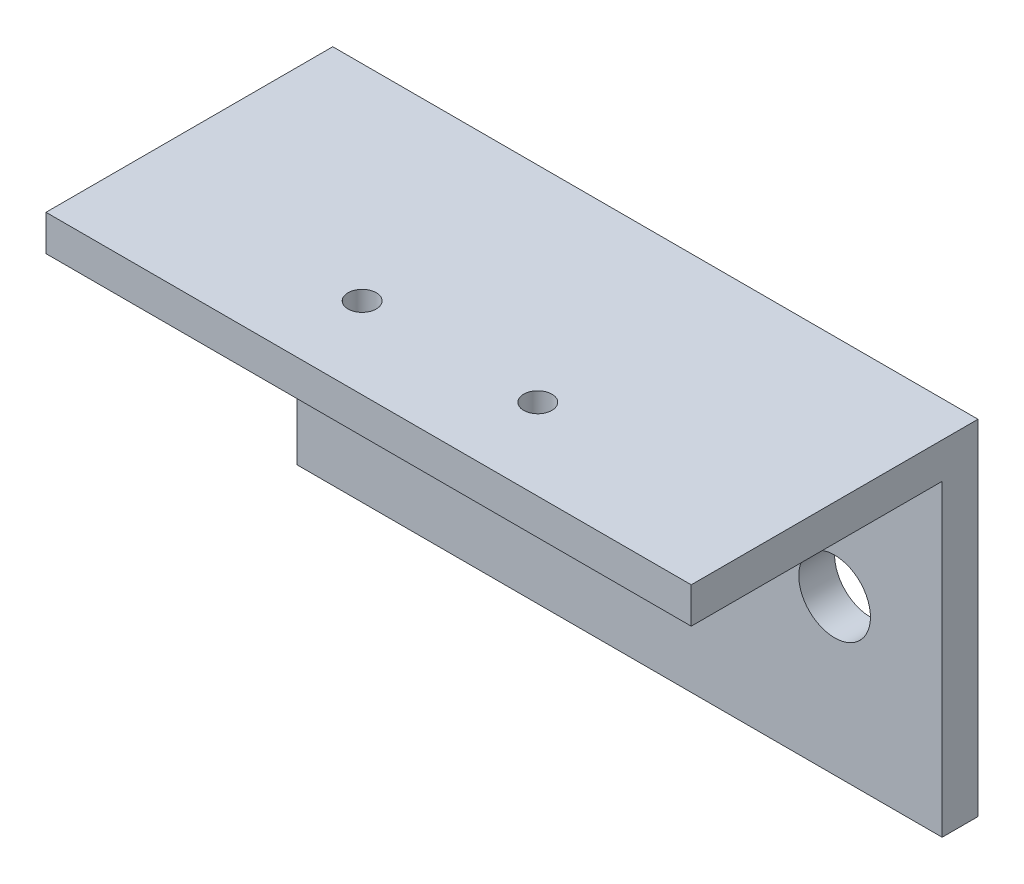
ISO-10303-21;
HEADER;
FILE_DESCRIPTION(('STEP AP214'),'2;1');
FILE_NAME('part.step','',(''),(''),'','','');
FILE_SCHEMA(('AUTOMOTIVE_DESIGN { 1 0 10303 214 1 1 1 1 }'));
ENDSEC;
DATA;
#1=APPLICATION_CONTEXT('core data for automotive mechanical design processes');
#2=APPLICATION_PROTOCOL_DEFINITION('international standard','automotive_design',2000,#1);
#3=PRODUCT_CONTEXT('',#1,'mechanical');
#4=PRODUCT('Part','Part','',(#3));
#5=PRODUCT_RELATED_PRODUCT_CATEGORY('part','',(#4));
#6=PRODUCT_DEFINITION_FORMATION('','',#4);
#7=PRODUCT_DEFINITION_CONTEXT('part definition',#1,'design');
#8=PRODUCT_DEFINITION('design','',#6,#7);
#9=PRODUCT_DEFINITION_SHAPE('','',#8);
#10=(LENGTH_UNIT() NAMED_UNIT(*) SI_UNIT(.MILLI.,.METRE.));
#11=(NAMED_UNIT(*) PLANE_ANGLE_UNIT() SI_UNIT($,.RADIAN.));
#12=(NAMED_UNIT(*) SI_UNIT($,.STERADIAN.) SOLID_ANGLE_UNIT());
#13=UNCERTAINTY_MEASURE_WITH_UNIT(LENGTH_MEASURE(1.E-05),#10,'distance_accuracy_value','');
#14=(GEOMETRIC_REPRESENTATION_CONTEXT(3) GLOBAL_UNCERTAINTY_ASSIGNED_CONTEXT((#13)) GLOBAL_UNIT_ASSIGNED_CONTEXT((#10,
#11,#12)) REPRESENTATION_CONTEXT('',''));
#15=CARTESIAN_POINT('',(0.,0.,0.));
#16=DIRECTION('',(0.,0.,1.));
#17=DIRECTION('',(1.,0.,0.));
#18=AXIS2_PLACEMENT_3D('',#15,#16,#17);
#19=CARTESIAN_POINT('',(0.,0.,3.175));
#20=DIRECTION('',(0.,0.,-1.));
#21=DIRECTION('',(-1.,0.,0.));
#22=AXIS2_PLACEMENT_3D('',#19,#20,#21);
#23=PLANE('',#22);
#24=CARTESIAN_POINT('',(47.625,13.713,3.175));
#25=DIRECTION('',(0.,0.,1.));
#26=DIRECTION('',(1.,0.,0.));
#27=AXIS2_PLACEMENT_3D('',#24,#25,#26);
#28=CIRCLE('',#27,3.175);
#29=CARTESIAN_POINT('',(50.8,13.713,3.175));
#30=VERTEX_POINT('',#29);
#31=EDGE_CURVE('E170',#30,#30,#28,.T.);
#32=ORIENTED_EDGE('',*,*,#31,.F.);
#33=EDGE_LOOP('',(#32));
#34=FACE_BOUND('',#33,.T.);
#35=CARTESIAN_POINT('',(9.525,13.713,3.175));
#36=DIRECTION('',(0.,0.,1.));
#37=DIRECTION('',(1.,0.,0.));
#38=AXIS2_PLACEMENT_3D('',#35,#36,#37);
#39=CIRCLE('',#38,3.175);
#40=CARTESIAN_POINT('',(12.7,13.713,3.175));
#41=VERTEX_POINT('',#40);
#42=EDGE_CURVE('E167',#41,#41,#39,.T.);
#43=ORIENTED_EDGE('',*,*,#42,.F.);
#44=EDGE_LOOP('',(#43));
#45=FACE_BOUND('',#44,.T.);
#46=DIRECTION('',(1.,0.,0.));
#47=VECTOR('',#46,1.);
#48=CARTESIAN_POINT('',(0.,27.305,3.175));
#49=LINE('',#48,#47);
#50=CARTESIAN_POINT('',(0.,27.305,3.175));
#51=VERTEX_POINT('',#50);
#52=CARTESIAN_POINT('',(57.15,27.305,3.175));
#53=VERTEX_POINT('',#52);
#54=EDGE_CURVE('E58',#51,#53,#49,.T.);
#55=ORIENTED_EDGE('',*,*,#54,.F.);
#56=DIRECTION('',(0.,-1.,0.));
#57=VECTOR('',#56,1.);
#58=CARTESIAN_POINT('',(0.,0.,3.175));
#59=LINE('',#58,#57);
#60=CARTESIAN_POINT('',(0.,0.,3.175));
#61=VERTEX_POINT('',#60);
#62=EDGE_CURVE('E96',#51,#61,#59,.T.);
#63=ORIENTED_EDGE('',*,*,#62,.T.);
#64=DIRECTION('',(1.,0.,0.));
#65=VECTOR('',#64,1.);
#66=CARTESIAN_POINT('',(0.,0.,3.175));
#67=LINE('',#66,#65);
#68=CARTESIAN_POINT('',(57.15,0.,3.175));
#69=VERTEX_POINT('',#68);
#70=EDGE_CURVE('E64',#61,#69,#67,.T.);
#71=ORIENTED_EDGE('',*,*,#70,.T.);
#72=DIRECTION('',(0.,1.,0.));
#73=VECTOR('',#72,1.);
#74=CARTESIAN_POINT('',(57.15,0.,3.175));
#75=LINE('',#74,#73);
#76=EDGE_CURVE('E107',#69,#53,#75,.T.);
#77=ORIENTED_EDGE('',*,*,#76,.T.);
#78=EDGE_LOOP('',(#55,#63,#71,#77));
#79=FACE_BOUND('',#78,.T.);
#80=ADVANCED_FACE('F41',(#34,#45,#79),#23,.F.);
#81=CARTESIAN_POINT('',(0.,0.,3.175));
#82=DIRECTION('',(1.,0.,0.));
#83=DIRECTION('',(0.,0.,-1.));
#84=AXIS2_PLACEMENT_3D('',#81,#82,#83);
#85=PLANE('',#84);
#86=DIRECTION('',(0.,-1.,0.));
#87=VECTOR('',#86,1.);
#88=CARTESIAN_POINT('',(0.,0.,0.));
#89=LINE('',#88,#87);
#90=CARTESIAN_POINT('',(0.,30.48,0.));
#91=VERTEX_POINT('',#90);
#92=CARTESIAN_POINT('',(0.,0.,0.));
#93=VERTEX_POINT('',#92);
#94=EDGE_CURVE('E103',#91,#93,#89,.T.);
#95=ORIENTED_EDGE('',*,*,#94,.T.);
#96=DIRECTION('',(0.,0.,-1.));
#97=VECTOR('',#96,1.);
#98=CARTESIAN_POINT('',(0.,0.,3.175));
#99=LINE('',#98,#97);
#100=EDGE_CURVE('E12',#61,#93,#99,.T.);
#101=ORIENTED_EDGE('',*,*,#100,.F.);
#102=ORIENTED_EDGE('',*,*,#62,.F.);
#103=DIRECTION('',(0.,0.,-1.));
#104=VECTOR('',#103,1.);
#105=CARTESIAN_POINT('',(0.,27.305,108.038126497991));
#106=LINE('',#105,#104);
#107=CARTESIAN_POINT('',(0.,27.305,25.4));
#108=VERTEX_POINT('',#107);
#109=EDGE_CURVE('E144',#108,#51,#106,.T.);
#110=ORIENTED_EDGE('',*,*,#109,.F.);
#111=DIRECTION('',(0.,1.,0.));
#112=VECTOR('',#111,1.);
#113=CARTESIAN_POINT('',(0.,30.48,25.4));
#114=LINE('',#113,#112);
#115=CARTESIAN_POINT('',(0.,30.48,25.4));
#116=VERTEX_POINT('',#115);
#117=EDGE_CURVE('E106',#108,#116,#114,.T.);
#118=ORIENTED_EDGE('',*,*,#117,.T.);
#119=DIRECTION('',(0.,0.,-1.));
#120=VECTOR('',#119,1.);
#121=CARTESIAN_POINT('',(0.,30.48,3.175));
#122=LINE('',#121,#120);
#123=EDGE_CURVE('E89',#116,#91,#122,.T.);
#124=ORIENTED_EDGE('',*,*,#123,.T.);
#125=EDGE_LOOP('',(#95,#101,#102,#110,#118,#124));
#126=FACE_BOUND('',#125,.T.);
#127=ADVANCED_FACE('F43',(#126),#85,.F.);
#128=CARTESIAN_POINT('',(0.,0.,3.175));
#129=DIRECTION('',(0.,1.,0.));
#130=DIRECTION('',(0.,0.,1.));
#131=AXIS2_PLACEMENT_3D('',#128,#129,#130);
#132=PLANE('',#131);
#133=DIRECTION('',(1.,0.,0.));
#134=VECTOR('',#133,1.);
#135=CARTESIAN_POINT('',(0.,0.,0.));
#136=LINE('',#135,#134);
#137=CARTESIAN_POINT('',(57.15,0.,0.));
#138=VERTEX_POINT('',#137);
#139=EDGE_CURVE('E110',#93,#138,#136,.T.);
#140=ORIENTED_EDGE('',*,*,#139,.T.);
#141=DIRECTION('',(0.,0.,-1.));
#142=VECTOR('',#141,1.);
#143=CARTESIAN_POINT('',(57.15,0.,3.175));
#144=LINE('',#143,#142);
#145=EDGE_CURVE('E50',#69,#138,#144,.T.);
#146=ORIENTED_EDGE('',*,*,#145,.F.);
#147=ORIENTED_EDGE('',*,*,#70,.F.);
#148=ORIENTED_EDGE('',*,*,#100,.T.);
#149=EDGE_LOOP('',(#140,#146,#147,#148));
#150=FACE_BOUND('',#149,.T.);
#151=ADVANCED_FACE('F219',(#150),#132,.F.);
#152=CARTESIAN_POINT('',(57.15,0.,3.175));
#153=DIRECTION('',(-1.,0.,0.));
#154=DIRECTION('',(0.,0.,1.));
#155=AXIS2_PLACEMENT_3D('',#152,#153,#154);
#156=PLANE('',#155);
#157=DIRECTION('',(0.,1.,0.));
#158=VECTOR('',#157,1.);
#159=CARTESIAN_POINT('',(57.15,0.,0.));
#160=LINE('',#159,#158);
#161=CARTESIAN_POINT('',(57.15,30.48,0.));
#162=VERTEX_POINT('',#161);
#163=EDGE_CURVE('E97',#138,#162,#160,.T.);
#164=ORIENTED_EDGE('',*,*,#163,.T.);
#165=DIRECTION('',(0.,0.,-1.));
#166=VECTOR('',#165,1.);
#167=CARTESIAN_POINT('',(57.15,30.48,3.175));
#168=LINE('',#167,#166);
#169=CARTESIAN_POINT('',(57.15,30.48,25.4));
#170=VERTEX_POINT('',#169);
#171=EDGE_CURVE('E92',#170,#162,#168,.T.);
#172=ORIENTED_EDGE('',*,*,#171,.F.);
#173=DIRECTION('',(0.,-1.,0.));
#174=VECTOR('',#173,1.);
#175=CARTESIAN_POINT('',(57.15,30.48,25.4));
#176=LINE('',#175,#174);
#177=CARTESIAN_POINT('',(57.15,27.305,25.4));
#178=VERTEX_POINT('',#177);
#179=EDGE_CURVE('E141',#170,#178,#176,.T.);
#180=ORIENTED_EDGE('',*,*,#179,.T.);
#181=DIRECTION('',(0.,0.,-1.));
#182=VECTOR('',#181,1.);
#183=CARTESIAN_POINT('',(57.15,27.305,108.038126497991));
#184=LINE('',#183,#182);
#185=EDGE_CURVE('E138',#178,#53,#184,.T.);
#186=ORIENTED_EDGE('',*,*,#185,.T.);
#187=ORIENTED_EDGE('',*,*,#76,.F.);
#188=ORIENTED_EDGE('',*,*,#145,.T.);
#189=EDGE_LOOP('',(#164,#172,#180,#186,#187,#188));
#190=FACE_BOUND('',#189,.T.);
#191=ADVANCED_FACE('F139',(#190),#156,.F.);
#192=CARTESIAN_POINT('',(0.,30.48,3.175));
#193=DIRECTION('',(0.,-1.,0.));
#194=DIRECTION('',(0.,0.,-1.));
#195=AXIS2_PLACEMENT_3D('',#192,#193,#194);
#196=PLANE('',#195);
#197=CARTESIAN_POINT('',(20.796825406948,30.48,18.1939997));
#198=DIRECTION('',(0.,1.,0.));
#199=DIRECTION('',(0.,0.,1.));
#200=AXIS2_PLACEMENT_3D('',#197,#198,#199);
#201=CIRCLE('',#200,1.25);
#202=CARTESIAN_POINT('',(20.796825406948,30.48,19.4439997));
#203=VERTEX_POINT('',#202);
#204=EDGE_CURVE('E161',#203,#203,#201,.T.);
#205=ORIENTED_EDGE('',*,*,#204,.F.);
#206=EDGE_LOOP('',(#205));
#207=FACE_BOUND('',#206,.T.);
#208=CARTESIAN_POINT('',(36.353174593052,30.48,18.1939997));
#209=DIRECTION('',(0.,1.,0.));
#210=DIRECTION('',(0.,0.,1.));
#211=AXIS2_PLACEMENT_3D('',#208,#209,#210);
#212=CIRCLE('',#211,1.25);
#213=CARTESIAN_POINT('',(36.353174593052,30.48,19.4439997));
#214=VERTEX_POINT('',#213);
#215=EDGE_CURVE('E150',#214,#214,#212,.T.);
#216=ORIENTED_EDGE('',*,*,#215,.F.);
#217=EDGE_LOOP('',(#216));
#218=FACE_BOUND('',#217,.T.);
#219=DIRECTION('',(-1.,0.,0.));
#220=VECTOR('',#219,1.);
#221=CARTESIAN_POINT('',(0.,30.48,0.));
#222=LINE('',#221,#220);
#223=EDGE_CURVE('E84',#162,#91,#222,.T.);
#224=ORIENTED_EDGE('',*,*,#223,.T.);
#225=ORIENTED_EDGE('',*,*,#123,.F.);
#226=DIRECTION('',(1.,0.,0.));
#227=VECTOR('',#226,1.);
#228=CARTESIAN_POINT('',(0.,30.48,25.4));
#229=LINE('',#228,#227);
#230=EDGE_CURVE('E128',#116,#170,#229,.T.);
#231=ORIENTED_EDGE('',*,*,#230,.T.);
#232=ORIENTED_EDGE('',*,*,#171,.T.);
#233=EDGE_LOOP('',(#224,#225,#231,#232));
#234=FACE_BOUND('',#233,.T.);
#235=ADVANCED_FACE('F86',(#207,#218,#234),#196,.F.);
#236=CARTESIAN_POINT('',(0.,0.,0.));
#237=DIRECTION('',(0.,0.,-1.));
#238=DIRECTION('',(-1.,0.,0.));
#239=AXIS2_PLACEMENT_3D('',#236,#237,#238);
#240=PLANE('',#239);
#241=CARTESIAN_POINT('',(47.625,13.713,0.));
#242=DIRECTION('',(0.,0.,1.));
#243=DIRECTION('',(1.,0.,0.));
#244=AXIS2_PLACEMENT_3D('',#241,#242,#243);
#245=CIRCLE('',#244,3.175);
#246=CARTESIAN_POINT('',(50.8,13.713,0.));
#247=VERTEX_POINT('',#246);
#248=EDGE_CURVE('E173',#247,#247,#245,.T.);
#249=ORIENTED_EDGE('',*,*,#248,.T.);
#250=EDGE_LOOP('',(#249));
#251=FACE_BOUND('',#250,.T.);
#252=CARTESIAN_POINT('',(9.525,13.713,0.));
#253=DIRECTION('',(0.,0.,1.));
#254=DIRECTION('',(1.,0.,0.));
#255=AXIS2_PLACEMENT_3D('',#252,#253,#254);
#256=CIRCLE('',#255,3.175);
#257=CARTESIAN_POINT('',(12.7,13.713,0.));
#258=VERTEX_POINT('',#257);
#259=EDGE_CURVE('E164',#258,#258,#256,.T.);
#260=ORIENTED_EDGE('',*,*,#259,.T.);
#261=EDGE_LOOP('',(#260));
#262=FACE_BOUND('',#261,.T.);
#263=ORIENTED_EDGE('',*,*,#94,.F.);
#264=ORIENTED_EDGE('',*,*,#223,.F.);
#265=ORIENTED_EDGE('',*,*,#163,.F.);
#266=ORIENTED_EDGE('',*,*,#139,.F.);
#267=EDGE_LOOP('',(#263,#264,#265,#266));
#268=FACE_BOUND('',#267,.T.);
#269=ADVANCED_FACE('F109',(#251,#262,#268),#240,.T.);
#270=CARTESIAN_POINT('',(0.,27.305,108.038126497991));
#271=DIRECTION('',(0.,1.,0.));
#272=DIRECTION('',(0.,0.,1.));
#273=AXIS2_PLACEMENT_3D('',#270,#271,#272);
#274=PLANE('',#273);
#275=CARTESIAN_POINT('',(20.796825406948,27.305,18.1939997));
#276=DIRECTION('',(0.,1.,0.));
#277=DIRECTION('',(0.,0.,1.));
#278=AXIS2_PLACEMENT_3D('',#275,#276,#277);
#279=CIRCLE('',#278,1.25);
#280=CARTESIAN_POINT('',(20.796825406948,27.305,19.4439997));
#281=VERTEX_POINT('',#280);
#282=EDGE_CURVE('E159',#281,#281,#279,.T.);
#283=ORIENTED_EDGE('',*,*,#282,.T.);
#284=EDGE_LOOP('',(#283));
#285=FACE_BOUND('',#284,.T.);
#286=CARTESIAN_POINT('',(36.353174593052,27.305,18.1939997));
#287=DIRECTION('',(0.,1.,0.));
#288=DIRECTION('',(0.,0.,1.));
#289=AXIS2_PLACEMENT_3D('',#286,#287,#288);
#290=CIRCLE('',#289,1.25);
#291=CARTESIAN_POINT('',(36.353174593052,27.305,19.4439997));
#292=VERTEX_POINT('',#291);
#293=EDGE_CURVE('E147',#292,#292,#290,.T.);
#294=ORIENTED_EDGE('',*,*,#293,.T.);
#295=EDGE_LOOP('',(#294));
#296=FACE_BOUND('',#295,.T.);
#297=ORIENTED_EDGE('',*,*,#185,.F.);
#298=DIRECTION('',(-1.,0.,0.));
#299=VECTOR('',#298,1.);
#300=CARTESIAN_POINT('',(0.,27.305,25.4));
#301=LINE('',#300,#299);
#302=EDGE_CURVE('E113',#178,#108,#301,.T.);
#303=ORIENTED_EDGE('',*,*,#302,.T.);
#304=ORIENTED_EDGE('',*,*,#109,.T.);
#305=ORIENTED_EDGE('',*,*,#54,.T.);
#306=EDGE_LOOP('',(#297,#303,#304,#305));
#307=FACE_BOUND('',#306,.T.);
#308=ADVANCED_FACE('F146',(#285,#296,#307),#274,.F.);
#309=CARTESIAN_POINT('',(0.,0.,25.4));
#310=DIRECTION('',(0.,0.,-1.));
#311=DIRECTION('',(-1.,0.,0.));
#312=AXIS2_PLACEMENT_3D('',#309,#310,#311);
#313=PLANE('',#312);
#314=ORIENTED_EDGE('',*,*,#302,.F.);
#315=ORIENTED_EDGE('',*,*,#179,.F.);
#316=ORIENTED_EDGE('',*,*,#230,.F.);
#317=ORIENTED_EDGE('',*,*,#117,.F.);
#318=EDGE_LOOP('',(#314,#315,#316,#317));
#319=FACE_BOUND('',#318,.T.);
#320=ADVANCED_FACE('F205',(#319),#313,.F.);
#321=CARTESIAN_POINT('',(36.353174593052,27.305,18.1939997));
#322=DIRECTION('',(0.,1.,0.));
#323=DIRECTION('',(0.,0.,1.));
#324=AXIS2_PLACEMENT_3D('',#321,#322,#323);
#325=CYLINDRICAL_SURFACE('',#324,1.25);
#326=ORIENTED_EDGE('',*,*,#293,.F.);
#327=EDGE_LOOP('',(#326));
#328=FACE_BOUND('',#327,.T.);
#329=ORIENTED_EDGE('',*,*,#215,.T.);
#330=EDGE_LOOP('',(#329));
#331=FACE_BOUND('',#330,.T.);
#332=ADVANCED_FACE('F198',(#328,#331),#325,.F.);
#333=CARTESIAN_POINT('',(20.796825406948,27.305,18.1939997));
#334=DIRECTION('',(0.,1.,0.));
#335=DIRECTION('',(0.,0.,1.));
#336=AXIS2_PLACEMENT_3D('',#333,#334,#335);
#337=CYLINDRICAL_SURFACE('',#336,1.25);
#338=ORIENTED_EDGE('',*,*,#282,.F.);
#339=EDGE_LOOP('',(#338));
#340=FACE_BOUND('',#339,.T.);
#341=ORIENTED_EDGE('',*,*,#204,.T.);
#342=EDGE_LOOP('',(#341));
#343=FACE_BOUND('',#342,.T.);
#344=ADVANCED_FACE('F188',(#340,#343),#337,.F.);
#345=CARTESIAN_POINT('',(9.525,13.713,0.));
#346=DIRECTION('',(0.,0.,1.));
#347=DIRECTION('',(1.,0.,0.));
#348=AXIS2_PLACEMENT_3D('',#345,#346,#347);
#349=CYLINDRICAL_SURFACE('',#348,3.175);
#350=ORIENTED_EDGE('',*,*,#259,.F.);
#351=EDGE_LOOP('',(#350));
#352=FACE_BOUND('',#351,.T.);
#353=ORIENTED_EDGE('',*,*,#42,.T.);
#354=EDGE_LOOP('',(#353));
#355=FACE_BOUND('',#354,.T.);
#356=ADVANCED_FACE('F186',(#352,#355),#349,.F.);
#357=CARTESIAN_POINT('',(47.625,13.713,0.));
#358=DIRECTION('',(0.,0.,1.));
#359=DIRECTION('',(1.,0.,0.));
#360=AXIS2_PLACEMENT_3D('',#357,#358,#359);
#361=CYLINDRICAL_SURFACE('',#360,3.175);
#362=ORIENTED_EDGE('',*,*,#248,.F.);
#363=EDGE_LOOP('',(#362));
#364=FACE_BOUND('',#363,.T.);
#365=ORIENTED_EDGE('',*,*,#31,.T.);
#366=EDGE_LOOP('',(#365));
#367=FACE_BOUND('',#366,.T.);
#368=ADVANCED_FACE('F179',(#364,#367),#361,.F.);
#369=CLOSED_SHELL('',(#80,#127,#151,#191,#235,#269,#308,#320,#332,#344,#356,#368));
#370=MANIFOLD_SOLID_BREP('B2',#369);
#371=ADVANCED_BREP_SHAPE_REPRESENTATION('',(#18,#370),#14);
#372=SHAPE_DEFINITION_REPRESENTATION(#9,#371);
ENDSEC;
END-ISO-10303-21;
